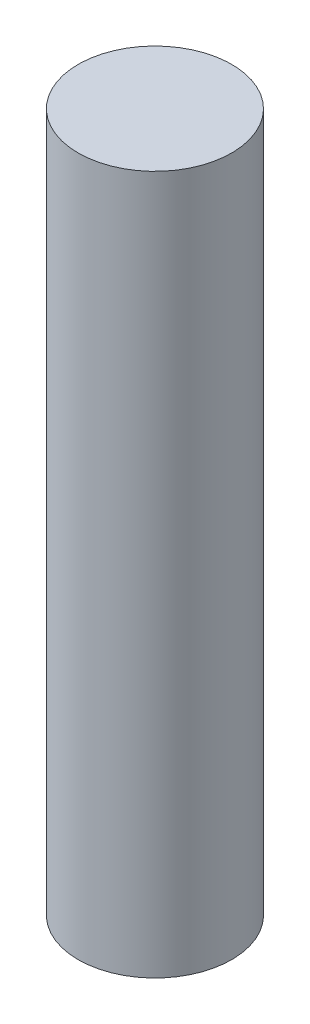
ISO-10303-21;
HEADER;
FILE_DESCRIPTION(('STEP AP214'),'2;1');
FILE_NAME('part.step','',(''),(''),'','','');
FILE_SCHEMA(('AUTOMOTIVE_DESIGN { 1 0 10303 214 1 1 1 1 }'));
ENDSEC;
DATA;
#1=APPLICATION_CONTEXT('core data for automotive mechanical design processes');
#2=APPLICATION_PROTOCOL_DEFINITION('international standard','automotive_design',2000,#1);
#3=PRODUCT_CONTEXT('',#1,'mechanical');
#4=PRODUCT('Part','Part','',(#3));
#5=PRODUCT_RELATED_PRODUCT_CATEGORY('part','',(#4));
#6=PRODUCT_DEFINITION_FORMATION('','',#4);
#7=PRODUCT_DEFINITION_CONTEXT('part definition',#1,'design');
#8=PRODUCT_DEFINITION('design','',#6,#7);
#9=PRODUCT_DEFINITION_SHAPE('','',#8);
#10=(LENGTH_UNIT() NAMED_UNIT(*) SI_UNIT(.MILLI.,.METRE.));
#11=(NAMED_UNIT(*) PLANE_ANGLE_UNIT() SI_UNIT($,.RADIAN.));
#12=(NAMED_UNIT(*) SI_UNIT($,.STERADIAN.) SOLID_ANGLE_UNIT());
#13=UNCERTAINTY_MEASURE_WITH_UNIT(LENGTH_MEASURE(1.E-05),#10,'distance_accuracy_value','');
#14=(GEOMETRIC_REPRESENTATION_CONTEXT(3) GLOBAL_UNCERTAINTY_ASSIGNED_CONTEXT((#13)) GLOBAL_UNIT_ASSIGNED_CONTEXT((#10,
#11,#12)) REPRESENTATION_CONTEXT('',''));
#15=CARTESIAN_POINT('',(0.,0.,0.));
#16=DIRECTION('',(0.,0.,1.));
#17=DIRECTION('',(1.,0.,0.));
#18=AXIS2_PLACEMENT_3D('',#15,#16,#17);
#19=CARTESIAN_POINT('',(0.,364.,0.));
#20=DIRECTION('',(0.,-1.,0.));
#21=DIRECTION('',(0.,0.,-1.));
#22=AXIS2_PLACEMENT_3D('',#19,#20,#21);
#23=CYLINDRICAL_SURFACE('',#22,40.);
#24=CARTESIAN_POINT('',(0.,364.,0.));
#25=DIRECTION('',(0.,1.,0.));
#26=DIRECTION('',(0.,0.,1.));
#27=AXIS2_PLACEMENT_3D('',#24,#25,#26);
#28=CIRCLE('',#27,40.);
#29=CARTESIAN_POINT('',(0.,364.,40.));
#30=VERTEX_POINT('',#29);
#31=EDGE_CURVE('E10',#30,#30,#28,.T.);
#32=ORIENTED_EDGE('',*,*,#31,.F.);
#33=EDGE_LOOP('',(#32));
#34=FACE_BOUND('',#33,.T.);
#35=CARTESIAN_POINT('',(0.,0.,0.));
#36=DIRECTION('',(0.,1.,0.));
#37=DIRECTION('',(0.,0.,1.));
#38=AXIS2_PLACEMENT_3D('',#35,#36,#37);
#39=CIRCLE('',#38,40.);
#40=CARTESIAN_POINT('',(0.,0.,40.));
#41=VERTEX_POINT('',#40);
#42=EDGE_CURVE('E34',#41,#41,#39,.T.);
#43=ORIENTED_EDGE('',*,*,#42,.T.);
#44=EDGE_LOOP('',(#43));
#45=FACE_BOUND('',#44,.T.);
#46=ADVANCED_FACE('F31',(#34,#45),#23,.T.);
#47=CARTESIAN_POINT('',(0.,364.,0.));
#48=DIRECTION('',(0.,1.,0.));
#49=DIRECTION('',(0.,0.,1.));
#50=AXIS2_PLACEMENT_3D('',#47,#48,#49);
#51=PLANE('',#50);
#52=ORIENTED_EDGE('',*,*,#31,.T.);
#53=EDGE_LOOP('',(#52));
#54=FACE_BOUND('',#53,.T.);
#55=ADVANCED_FACE('F46',(#54),#51,.T.);
#56=CARTESIAN_POINT('',(0.,0.,0.));
#57=DIRECTION('',(0.,1.,0.));
#58=DIRECTION('',(0.,0.,1.));
#59=AXIS2_PLACEMENT_3D('',#56,#57,#58);
#60=PLANE('',#59);
#61=ORIENTED_EDGE('',*,*,#42,.F.);
#62=EDGE_LOOP('',(#61));
#63=FACE_BOUND('',#62,.T.);
#64=ADVANCED_FACE('F44',(#63),#60,.F.);
#65=CLOSED_SHELL('',(#46,#55,#64));
#66=MANIFOLD_SOLID_BREP('B2',#65);
#67=ADVANCED_BREP_SHAPE_REPRESENTATION('',(#18,#66),#14);
#68=SHAPE_DEFINITION_REPRESENTATION(#9,#67);
ENDSEC;
END-ISO-10303-21;
